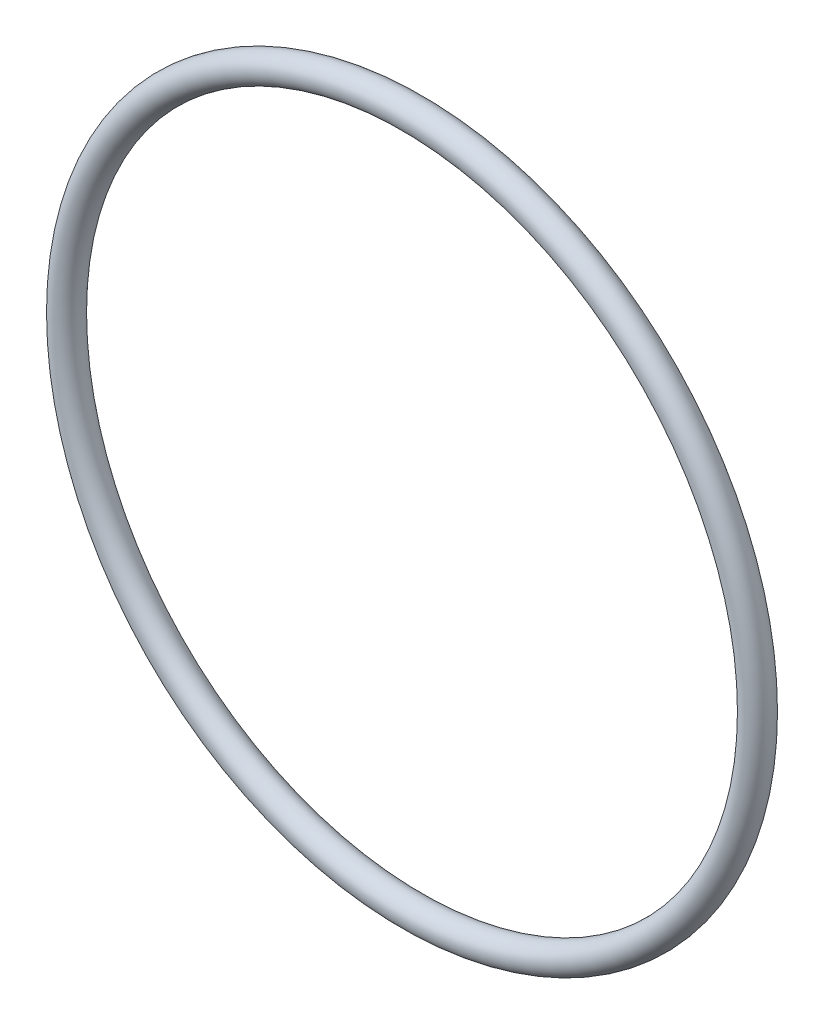
ISO-10303-21;
HEADER;
FILE_DESCRIPTION(('STEP AP214'),'2;1');
FILE_NAME('part.step','',(''),(''),'','','');
FILE_SCHEMA(('AUTOMOTIVE_DESIGN { 1 0 10303 214 1 1 1 1 }'));
ENDSEC;
DATA;
#1=APPLICATION_CONTEXT('core data for automotive mechanical design processes');
#2=APPLICATION_PROTOCOL_DEFINITION('international standard','automotive_design',2000,#1);
#3=PRODUCT_CONTEXT('',#1,'mechanical');
#4=PRODUCT('Part','Part','',(#3));
#5=PRODUCT_RELATED_PRODUCT_CATEGORY('part','',(#4));
#6=PRODUCT_DEFINITION_FORMATION('','',#4);
#7=PRODUCT_DEFINITION_CONTEXT('part definition',#1,'design');
#8=PRODUCT_DEFINITION('design','',#6,#7);
#9=PRODUCT_DEFINITION_SHAPE('','',#8);
#10=(LENGTH_UNIT() NAMED_UNIT(*) SI_UNIT(.MILLI.,.METRE.));
#11=(NAMED_UNIT(*) PLANE_ANGLE_UNIT() SI_UNIT($,.RADIAN.));
#12=(NAMED_UNIT(*) SI_UNIT($,.STERADIAN.) SOLID_ANGLE_UNIT());
#13=UNCERTAINTY_MEASURE_WITH_UNIT(LENGTH_MEASURE(1.E-05),#10,'distance_accuracy_value','');
#14=(GEOMETRIC_REPRESENTATION_CONTEXT(3) GLOBAL_UNCERTAINTY_ASSIGNED_CONTEXT((#13)) GLOBAL_UNIT_ASSIGNED_CONTEXT((#10,
#11,#12)) REPRESENTATION_CONTEXT('',''));
#15=CARTESIAN_POINT('',(0.,0.,0.));
#16=DIRECTION('',(0.,0.,1.));
#17=DIRECTION('',(1.,0.,0.));
#18=AXIS2_PLACEMENT_3D('',#15,#16,#17);
#19=CARTESIAN_POINT('',(0.,0.,0.));
#20=DIRECTION('',(0.,0.,1.));
#21=DIRECTION('',(1.,0.,0.));
#22=AXIS2_PLACEMENT_3D('',#19,#20,#21);
#23=TOROIDAL_SURFACE('',#22,43.0403,1.7653);
#24=CARTESIAN_POINT('',(44.8056,0.,0.));
#25=VERTEX_POINT('',#24);
#26=VERTEX_LOOP('',#25);
#27=FACE_BOUND('',#26,.T.);
#28=ADVANCED_FACE('F31',(#27),#23,.T.);
#29=CLOSED_SHELL('',(#28));
#30=MANIFOLD_SOLID_BREP('B2',#29);
#31=ADVANCED_BREP_SHAPE_REPRESENTATION('',(#18,#30),#14);
#32=SHAPE_DEFINITION_REPRESENTATION(#9,#31);
ENDSEC;
END-ISO-10303-21;
